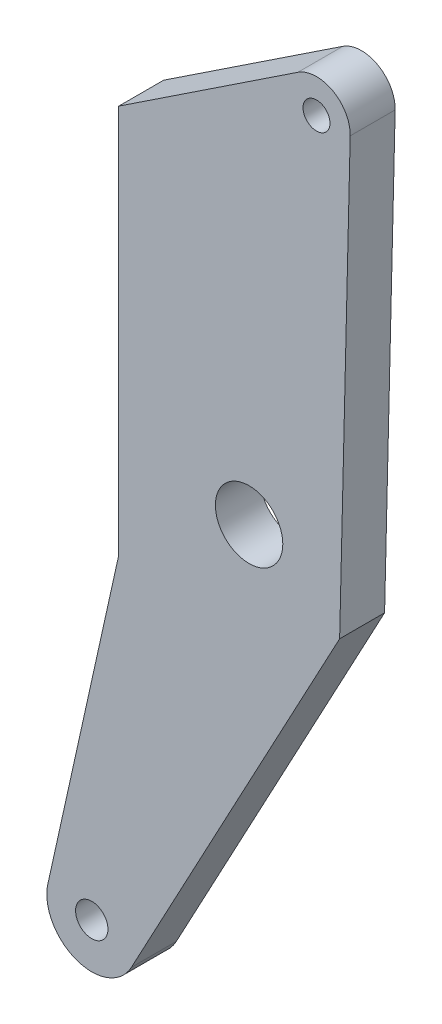
ISO-10303-21;
HEADER;
FILE_DESCRIPTION(('STEP AP214'),'2;1');
FILE_NAME('part.step','',(''),(''),'','','');
FILE_SCHEMA(('AUTOMOTIVE_DESIGN { 1 0 10303 214 1 1 1 1 }'));
ENDSEC;
DATA;
#1=APPLICATION_CONTEXT('core data for automotive mechanical design processes');
#2=APPLICATION_PROTOCOL_DEFINITION('international standard','automotive_design',2000,#1);
#3=PRODUCT_CONTEXT('',#1,'mechanical');
#4=PRODUCT('Part','Part','',(#3));
#5=PRODUCT_RELATED_PRODUCT_CATEGORY('part','',(#4));
#6=PRODUCT_DEFINITION_FORMATION('','',#4);
#7=PRODUCT_DEFINITION_CONTEXT('part definition',#1,'design');
#8=PRODUCT_DEFINITION('design','',#6,#7);
#9=PRODUCT_DEFINITION_SHAPE('','',#8);
#10=(LENGTH_UNIT() NAMED_UNIT(*) SI_UNIT(.MILLI.,.METRE.));
#11=(NAMED_UNIT(*) PLANE_ANGLE_UNIT() SI_UNIT($,.RADIAN.));
#12=(NAMED_UNIT(*) SI_UNIT($,.STERADIAN.) SOLID_ANGLE_UNIT());
#13=UNCERTAINTY_MEASURE_WITH_UNIT(LENGTH_MEASURE(1.E-05),#10,'distance_accuracy_value','');
#14=(GEOMETRIC_REPRESENTATION_CONTEXT(3) GLOBAL_UNCERTAINTY_ASSIGNED_CONTEXT((#13)) GLOBAL_UNIT_ASSIGNED_CONTEXT((#10,
#11,#12)) REPRESENTATION_CONTEXT('',''));
#15=CARTESIAN_POINT('',(0.,0.,0.));
#16=DIRECTION('',(0.,0.,1.));
#17=DIRECTION('',(1.,0.,0.));
#18=AXIS2_PLACEMENT_3D('',#15,#16,#17);
#19=CARTESIAN_POINT('',(31.75,114.3,6.35));
#20=DIRECTION('',(0.,0.,1.));
#21=DIRECTION('',(1.,0.,0.));
#22=AXIS2_PLACEMENT_3D('',#19,#20,#21);
#23=PLANE('',#22);
#24=CARTESIAN_POINT('',(22.225,59.4836059347447,6.35));
#25=DIRECTION('',(0.,0.,1.));
#26=DIRECTION('',(1.,0.,0.));
#27=AXIS2_PLACEMENT_3D('',#24,#25,#26);
#28=CIRCLE('',#27,4.7625);
#29=CARTESIAN_POINT('',(26.9875,59.4836059347447,6.35));
#30=VERTEX_POINT('',#29);
#31=EDGE_CURVE('E200',#30,#30,#28,.T.);
#32=ORIENTED_EDGE('',*,*,#31,.F.);
#33=EDGE_LOOP('',(#32));
#34=FACE_BOUND('',#33,.T.);
#35=CARTESIAN_POINT('',(31.75,114.3,6.35));
#36=DIRECTION('',(0.,0.,1.));
#37=DIRECTION('',(1.,0.,0.));
#38=AXIS2_PLACEMENT_3D('',#35,#36,#37);
#39=CIRCLE('',#38,4.76250000000002);
#40=CARTESIAN_POINT('',(36.511130591901,114.1857995759,6.35));
#41=VERTEX_POINT('',#40);
#42=CARTESIAN_POINT('',(29.1165690932561,118.268179420012,6.35));
#43=VERTEX_POINT('',#42);
#44=EDGE_CURVE('E163',#41,#43,#39,.T.);
#45=ORIENTED_EDGE('',*,*,#44,.T.);
#46=DIRECTION('',(-0.833213526511694,-0.55295137149477,0.));
#47=VECTOR('',#46,1.);
#48=CARTESIAN_POINT('',(3.80999999999993,101.473802417364,6.35));
#49=LINE('',#48,#47);
#50=CARTESIAN_POINT('',(3.80999999999993,101.473802417364,6.35));
#51=VERTEX_POINT('',#50);
#52=EDGE_CURVE('E105',#43,#51,#49,.T.);
#53=ORIENTED_EDGE('',*,*,#52,.T.);
#54=DIRECTION('',(0.,-1.,0.));
#55=VECTOR('',#54,1.);
#56=CARTESIAN_POINT('',(3.80999999999995,46.5296059347448,6.35));
#57=LINE('',#56,#55);
#58=CARTESIAN_POINT('',(3.80999999999995,46.5296059347448,6.35));
#59=VERTEX_POINT('',#58);
#60=EDGE_CURVE('E180',#51,#59,#57,.T.);
#61=ORIENTED_EDGE('',*,*,#60,.T.);
#62=DIRECTION('',(-0.216118883336142,-0.97636705611442,0.));
#63=VECTOR('',#62,1.);
#64=CARTESIAN_POINT('',(-6.09504730309555,1.78126313974876,6.35));
#65=LINE('',#64,#63);
#66=CARTESIAN_POINT('',(-6.09504730309555,1.78126313974876,6.35));
#67=VERTEX_POINT('',#66);
#68=EDGE_CURVE('E121',#59,#67,#65,.T.);
#69=ORIENTED_EDGE('',*,*,#68,.T.);
#70=CARTESIAN_POINT('',(0.,0.,6.35));
#71=DIRECTION('',(0.,0.,1.));
#72=DIRECTION('',(1.,0.,0.));
#73=AXIS2_PLACEMENT_3D('',#70,#71,#72);
#74=CIRCLE('',#73,6.35);
#75=CARTESIAN_POINT('',(5.59719657720947,-2.99898157314689,6.35));
#76=VERTEX_POINT('',#75);
#77=EDGE_CURVE('E115',#67,#76,#74,.T.);
#78=ORIENTED_EDGE('',*,*,#77,.T.);
#79=DIRECTION('',(0.472280562700297,0.881448279875507,0.));
#80=VECTOR('',#79,1.);
#81=CARTESIAN_POINT('',(5.59719657720947,-2.99898157314689,6.35));
#82=LINE('',#81,#80);
#83=CARTESIAN_POINT('',(35.0173801908307,51.9098423081026,6.35));
#84=VERTEX_POINT('',#83);
#85=EDGE_CURVE('E119',#76,#84,#82,.T.);
#86=ORIENTED_EDGE('',*,*,#85,.T.);
#87=DIRECTION('',(0.0239790916744878,0.999712460241677,0.));
#88=VECTOR('',#87,1.);
#89=CARTESIAN_POINT('',(35.0173801908307,51.9098423081026,6.35));
#90=LINE('',#89,#88);
#91=EDGE_CURVE('E65',#84,#41,#90,.T.);
#92=ORIENTED_EDGE('',*,*,#91,.T.);
#93=EDGE_LOOP('',(#45,#53,#61,#69,#78,#86,#92));
#94=FACE_BOUND('',#93,.T.);
#95=CARTESIAN_POINT('',(0.,0.,6.35));
#96=DIRECTION('',(0.,0.,1.));
#97=DIRECTION('',(1.,0.,0.));
#98=AXIS2_PLACEMENT_3D('',#95,#96,#97);
#99=CIRCLE('',#98,2.286);
#100=CARTESIAN_POINT('',(2.286,0.,6.35));
#101=VERTEX_POINT('',#100);
#102=EDGE_CURVE('E148',#101,#101,#99,.T.);
#103=ORIENTED_EDGE('',*,*,#102,.F.);
#104=EDGE_LOOP('',(#103));
#105=FACE_BOUND('',#104,.T.);
#106=CARTESIAN_POINT('',(31.75,114.3,6.35));
#107=DIRECTION('',(0.,0.,1.));
#108=DIRECTION('',(1.,0.,0.));
#109=AXIS2_PLACEMENT_3D('',#106,#107,#108);
#110=CIRCLE('',#109,1.90500000000001);
#111=CARTESIAN_POINT('',(33.655,114.3,6.35));
#112=VERTEX_POINT('',#111);
#113=EDGE_CURVE('E208',#112,#112,#110,.T.);
#114=ORIENTED_EDGE('',*,*,#113,.F.);
#115=EDGE_LOOP('',(#114));
#116=FACE_BOUND('',#115,.T.);
#117=ADVANCED_FACE('F47',(#34,#94,#105,#116),#23,.T.);
#118=CARTESIAN_POINT('',(31.75,114.3,0.));
#119=DIRECTION('',(0.,0.,1.));
#120=DIRECTION('',(1.,0.,0.));
#121=AXIS2_PLACEMENT_3D('',#118,#119,#120);
#122=PLANE('',#121);
#123=CARTESIAN_POINT('',(31.75,114.3,0.));
#124=DIRECTION('',(0.,0.,1.));
#125=DIRECTION('',(1.,0.,0.));
#126=AXIS2_PLACEMENT_3D('',#123,#124,#125);
#127=CIRCLE('',#126,4.76250000000002);
#128=CARTESIAN_POINT('',(36.511130591901,114.1857995759,0.));
#129=VERTEX_POINT('',#128);
#130=CARTESIAN_POINT('',(29.1165690932561,118.268179420012,0.));
#131=VERTEX_POINT('',#130);
#132=EDGE_CURVE('E143',#129,#131,#127,.T.);
#133=ORIENTED_EDGE('',*,*,#132,.F.);
#134=DIRECTION('',(0.0239790916744878,0.999712460241677,0.));
#135=VECTOR('',#134,1.);
#136=CARTESIAN_POINT('',(35.0173801908307,51.9098423081026,0.));
#137=LINE('',#136,#135);
#138=CARTESIAN_POINT('',(35.0173801908307,51.9098423081026,0.));
#139=VERTEX_POINT('',#138);
#140=EDGE_CURVE('E97',#139,#129,#137,.T.);
#141=ORIENTED_EDGE('',*,*,#140,.F.);
#142=DIRECTION('',(0.472280562700297,0.881448279875507,0.));
#143=VECTOR('',#142,1.);
#144=CARTESIAN_POINT('',(5.59719657720947,-2.99898157314689,0.));
#145=LINE('',#144,#143);
#146=CARTESIAN_POINT('',(5.59719657720947,-2.99898157314689,0.));
#147=VERTEX_POINT('',#146);
#148=EDGE_CURVE('E91',#147,#139,#145,.T.);
#149=ORIENTED_EDGE('',*,*,#148,.F.);
#150=CARTESIAN_POINT('',(0.,0.,0.));
#151=DIRECTION('',(0.,0.,1.));
#152=DIRECTION('',(1.,0.,0.));
#153=AXIS2_PLACEMENT_3D('',#150,#151,#152);
#154=CIRCLE('',#153,6.35);
#155=CARTESIAN_POINT('',(-6.09504730309555,1.78126313974876,0.));
#156=VERTEX_POINT('',#155);
#157=EDGE_CURVE('E130',#156,#147,#154,.T.);
#158=ORIENTED_EDGE('',*,*,#157,.F.);
#159=DIRECTION('',(-0.216118883336142,-0.97636705611442,0.));
#160=VECTOR('',#159,1.);
#161=CARTESIAN_POINT('',(-6.09504730309555,1.78126313974876,0.));
#162=LINE('',#161,#160);
#163=CARTESIAN_POINT('',(3.80999999999995,46.5296059347448,0.));
#164=VERTEX_POINT('',#163);
#165=EDGE_CURVE('E154',#164,#156,#162,.T.);
#166=ORIENTED_EDGE('',*,*,#165,.F.);
#167=DIRECTION('',(0.,-1.,0.));
#168=VECTOR('',#167,1.);
#169=CARTESIAN_POINT('',(3.80999999999995,46.5296059347448,0.));
#170=LINE('',#169,#168);
#171=CARTESIAN_POINT('',(3.80999999999993,101.473802417364,0.));
#172=VERTEX_POINT('',#171);
#173=EDGE_CURVE('E151',#172,#164,#170,.T.);
#174=ORIENTED_EDGE('',*,*,#173,.F.);
#175=DIRECTION('',(-0.833213526511694,-0.55295137149477,0.));
#176=VECTOR('',#175,1.);
#177=CARTESIAN_POINT('',(3.80999999999993,101.473802417364,0.));
#178=LINE('',#177,#176);
#179=EDGE_CURVE('E147',#131,#172,#178,.T.);
#180=ORIENTED_EDGE('',*,*,#179,.F.);
#181=EDGE_LOOP('',(#133,#141,#149,#158,#166,#174,#180));
#182=FACE_BOUND('',#181,.T.);
#183=CARTESIAN_POINT('',(0.,0.,0.));
#184=DIRECTION('',(0.,0.,1.));
#185=DIRECTION('',(1.,0.,0.));
#186=AXIS2_PLACEMENT_3D('',#183,#184,#185);
#187=CIRCLE('',#186,2.286);
#188=CARTESIAN_POINT('',(2.286,0.,0.));
#189=VERTEX_POINT('',#188);
#190=EDGE_CURVE('E196',#189,#189,#187,.T.);
#191=ORIENTED_EDGE('',*,*,#190,.T.);
#192=EDGE_LOOP('',(#191));
#193=FACE_BOUND('',#192,.T.);
#194=CARTESIAN_POINT('',(22.225,59.4836059347447,0.));
#195=DIRECTION('',(0.,0.,1.));
#196=DIRECTION('',(1.,0.,0.));
#197=AXIS2_PLACEMENT_3D('',#194,#195,#196);
#198=CIRCLE('',#197,4.7625);
#199=CARTESIAN_POINT('',(26.9875,59.4836059347447,0.));
#200=VERTEX_POINT('',#199);
#201=EDGE_CURVE('E204',#200,#200,#198,.T.);
#202=ORIENTED_EDGE('',*,*,#201,.T.);
#203=EDGE_LOOP('',(#202));
#204=FACE_BOUND('',#203,.T.);
#205=CARTESIAN_POINT('',(31.75,114.3,0.));
#206=DIRECTION('',(0.,0.,1.));
#207=DIRECTION('',(1.,0.,0.));
#208=AXIS2_PLACEMENT_3D('',#205,#206,#207);
#209=CIRCLE('',#208,1.90500000000001);
#210=CARTESIAN_POINT('',(33.655,114.3,0.));
#211=VERTEX_POINT('',#210);
#212=EDGE_CURVE('E212',#211,#211,#209,.T.);
#213=ORIENTED_EDGE('',*,*,#212,.T.);
#214=EDGE_LOOP('',(#213));
#215=FACE_BOUND('',#214,.T.);
#216=ADVANCED_FACE('F184',(#182,#193,#204,#215),#122,.F.);
#217=CARTESIAN_POINT('',(31.75,114.3,6.35));
#218=DIRECTION('',(0.,0.,-1.));
#219=DIRECTION('',(-1.,0.,0.));
#220=AXIS2_PLACEMENT_3D('',#217,#218,#219);
#221=CYLINDRICAL_SURFACE('',#220,4.76250000000002);
#222=ORIENTED_EDGE('',*,*,#132,.T.);
#223=DIRECTION('',(0.,0.,-1.));
#224=VECTOR('',#223,1.);
#225=CARTESIAN_POINT('',(29.1165690932561,118.268179420012,6.35));
#226=LINE('',#225,#224);
#227=EDGE_CURVE('E11',#43,#131,#226,.T.);
#228=ORIENTED_EDGE('',*,*,#227,.F.);
#229=ORIENTED_EDGE('',*,*,#44,.F.);
#230=DIRECTION('',(0.,0.,-1.));
#231=VECTOR('',#230,1.);
#232=CARTESIAN_POINT('',(36.511130591901,114.1857995759,6.35));
#233=LINE('',#232,#231);
#234=EDGE_CURVE('E139',#41,#129,#233,.T.);
#235=ORIENTED_EDGE('',*,*,#234,.T.);
#236=EDGE_LOOP('',(#222,#228,#229,#235));
#237=FACE_BOUND('',#236,.T.);
#238=ADVANCED_FACE('F49',(#237),#221,.T.);
#239=CARTESIAN_POINT('',(3.80999999999993,101.473802417364,6.35));
#240=DIRECTION('',(0.55295137149477,-0.833213526511694,0.));
#241=DIRECTION('',(0.833213526511694,0.55295137149477,0.));
#242=AXIS2_PLACEMENT_3D('',#239,#240,#241);
#243=PLANE('',#242);
#244=ORIENTED_EDGE('',*,*,#179,.T.);
#245=DIRECTION('',(0.,0.,-1.));
#246=VECTOR('',#245,1.);
#247=CARTESIAN_POINT('',(3.80999999999993,101.473802417364,6.35));
#248=LINE('',#247,#246);
#249=EDGE_CURVE('E57',#51,#172,#248,.T.);
#250=ORIENTED_EDGE('',*,*,#249,.F.);
#251=ORIENTED_EDGE('',*,*,#52,.F.);
#252=ORIENTED_EDGE('',*,*,#227,.T.);
#253=EDGE_LOOP('',(#244,#250,#251,#252));
#254=FACE_BOUND('',#253,.T.);
#255=ADVANCED_FACE('F247',(#254),#243,.F.);
#256=CARTESIAN_POINT('',(3.80999999999995,46.5296059347448,6.35));
#257=DIRECTION('',(1.,0.,0.));
#258=DIRECTION('',(0.,1.,0.));
#259=AXIS2_PLACEMENT_3D('',#256,#257,#258);
#260=PLANE('',#259);
#261=CARTESIAN_POINT('',(3.80999999999993,89.8767041760544,3.175));
#262=DIRECTION('',(-1.,0.,0.));
#263=DIRECTION('',(0.,-1.,0.));
#264=AXIS2_PLACEMENT_3D('',#261,#262,#263);
#265=CIRCLE('',#264,1.90500000000001);
#266=CARTESIAN_POINT('',(3.80999999999993,87.9717041760544,3.175));
#267=VERTEX_POINT('',#266);
#268=EDGE_CURVE('E228',#267,#267,#265,.T.);
#269=ORIENTED_EDGE('',*,*,#268,.F.);
#270=EDGE_LOOP('',(#269));
#271=FACE_BOUND('',#270,.T.);
#272=CARTESIAN_POINT('',(3.80999999999994,58.1267041760544,3.175));
#273=DIRECTION('',(-1.,0.,0.));
#274=DIRECTION('',(0.,-1.,0.));
#275=AXIS2_PLACEMENT_3D('',#272,#273,#274);
#276=CIRCLE('',#275,1.905);
#277=CARTESIAN_POINT('',(3.80999999999994,56.2217041760544,3.175));
#278=VERTEX_POINT('',#277);
#279=EDGE_CURVE('E224',#278,#278,#276,.T.);
#280=ORIENTED_EDGE('',*,*,#279,.F.);
#281=EDGE_LOOP('',(#280));
#282=FACE_BOUND('',#281,.T.);
#283=ORIENTED_EDGE('',*,*,#173,.T.);
#284=DIRECTION('',(0.,0.,-1.));
#285=VECTOR('',#284,1.);
#286=CARTESIAN_POINT('',(3.80999999999995,46.5296059347448,6.35));
#287=LINE('',#286,#285);
#288=EDGE_CURVE('E170',#59,#164,#287,.T.);
#289=ORIENTED_EDGE('',*,*,#288,.F.);
#290=ORIENTED_EDGE('',*,*,#60,.F.);
#291=ORIENTED_EDGE('',*,*,#249,.T.);
#292=EDGE_LOOP('',(#283,#289,#290,#291));
#293=FACE_BOUND('',#292,.T.);
#294=ADVANCED_FACE('F178',(#271,#282,#293),#260,.F.);
#295=CARTESIAN_POINT('',(-6.09504730309555,1.78126313974876,6.35));
#296=DIRECTION('',(0.97636705611442,-0.216118883336142,0.));
#297=DIRECTION('',(0.216118883336142,0.97636705611442,0.));
#298=AXIS2_PLACEMENT_3D('',#295,#296,#297);
#299=PLANE('',#298);
#300=ORIENTED_EDGE('',*,*,#165,.T.);
#301=DIRECTION('',(0.,0.,-1.));
#302=VECTOR('',#301,1.);
#303=CARTESIAN_POINT('',(-6.09504730309555,1.78126313974876,6.35));
#304=LINE('',#303,#302);
#305=EDGE_CURVE('E132',#67,#156,#304,.T.);
#306=ORIENTED_EDGE('',*,*,#305,.F.);
#307=ORIENTED_EDGE('',*,*,#68,.F.);
#308=ORIENTED_EDGE('',*,*,#288,.T.);
#309=EDGE_LOOP('',(#300,#306,#307,#308));
#310=FACE_BOUND('',#309,.T.);
#311=ADVANCED_FACE('F187',(#310),#299,.F.);
#312=CARTESIAN_POINT('',(0.,0.,6.35));
#313=DIRECTION('',(0.,0.,-1.));
#314=DIRECTION('',(-1.,0.,0.));
#315=AXIS2_PLACEMENT_3D('',#312,#313,#314);
#316=CYLINDRICAL_SURFACE('',#315,6.35);
#317=ORIENTED_EDGE('',*,*,#157,.T.);
#318=DIRECTION('',(0.,0.,-1.));
#319=VECTOR('',#318,1.);
#320=CARTESIAN_POINT('',(5.59719657720947,-2.99898157314689,6.35));
#321=LINE('',#320,#319);
#322=EDGE_CURVE('E127',#76,#147,#321,.T.);
#323=ORIENTED_EDGE('',*,*,#322,.F.);
#324=ORIENTED_EDGE('',*,*,#77,.F.);
#325=ORIENTED_EDGE('',*,*,#305,.T.);
#326=EDGE_LOOP('',(#317,#323,#324,#325));
#327=FACE_BOUND('',#326,.T.);
#328=ADVANCED_FACE('F128',(#327),#316,.T.);
#329=CARTESIAN_POINT('',(5.59719657720947,-2.99898157314689,6.35));
#330=DIRECTION('',(-0.881448279875508,0.472280562700297,0.));
#331=DIRECTION('',(-0.472280562700297,-0.881448279875508,0.));
#332=AXIS2_PLACEMENT_3D('',#329,#330,#331);
#333=PLANE('',#332);
#334=ORIENTED_EDGE('',*,*,#148,.T.);
#335=DIRECTION('',(0.,0.,-1.));
#336=VECTOR('',#335,1.);
#337=CARTESIAN_POINT('',(35.0173801908307,51.9098423081026,6.35));
#338=LINE('',#337,#336);
#339=EDGE_CURVE('E133',#84,#139,#338,.T.);
#340=ORIENTED_EDGE('',*,*,#339,.F.);
#341=ORIENTED_EDGE('',*,*,#85,.F.);
#342=ORIENTED_EDGE('',*,*,#322,.T.);
#343=EDGE_LOOP('',(#334,#340,#341,#342));
#344=FACE_BOUND('',#343,.T.);
#345=ADVANCED_FACE('F135',(#344),#333,.F.);
#346=CARTESIAN_POINT('',(35.0173801908307,51.9098423081026,6.35));
#347=DIRECTION('',(-0.999712460241677,0.0239790916744878,0.));
#348=DIRECTION('',(-0.0239790916744878,-0.999712460241677,0.));
#349=AXIS2_PLACEMENT_3D('',#346,#347,#348);
#350=PLANE('',#349);
#351=ORIENTED_EDGE('',*,*,#140,.T.);
#352=ORIENTED_EDGE('',*,*,#234,.F.);
#353=ORIENTED_EDGE('',*,*,#91,.F.);
#354=ORIENTED_EDGE('',*,*,#339,.T.);
#355=EDGE_LOOP('',(#351,#352,#353,#354));
#356=FACE_BOUND('',#355,.T.);
#357=ADVANCED_FACE('F280',(#356),#350,.F.);
#358=CARTESIAN_POINT('',(0.,0.,6.35));
#359=DIRECTION('',(0.,0.,-1.));
#360=DIRECTION('',(-1.,0.,0.));
#361=AXIS2_PLACEMENT_3D('',#358,#359,#360);
#362=CYLINDRICAL_SURFACE('',#361,2.286);
#363=ORIENTED_EDGE('',*,*,#102,.T.);
#364=EDGE_LOOP('',(#363));
#365=FACE_BOUND('',#364,.T.);
#366=ORIENTED_EDGE('',*,*,#190,.F.);
#367=EDGE_LOOP('',(#366));
#368=FACE_BOUND('',#367,.T.);
#369=ADVANCED_FACE('F277',(#365,#368),#362,.F.);
#370=CARTESIAN_POINT('',(22.225,59.4836059347447,6.35));
#371=DIRECTION('',(0.,0.,-1.));
#372=DIRECTION('',(-1.,0.,0.));
#373=AXIS2_PLACEMENT_3D('',#370,#371,#372);
#374=CYLINDRICAL_SURFACE('',#373,4.7625);
#375=ORIENTED_EDGE('',*,*,#31,.T.);
#376=EDGE_LOOP('',(#375));
#377=FACE_BOUND('',#376,.T.);
#378=ORIENTED_EDGE('',*,*,#201,.F.);
#379=EDGE_LOOP('',(#378));
#380=FACE_BOUND('',#379,.T.);
#381=ADVANCED_FACE('F263',(#377,#380),#374,.F.);
#382=CARTESIAN_POINT('',(31.75,114.3,6.35));
#383=DIRECTION('',(0.,0.,-1.));
#384=DIRECTION('',(-1.,0.,0.));
#385=AXIS2_PLACEMENT_3D('',#382,#383,#384);
#386=CYLINDRICAL_SURFACE('',#385,1.90500000000001);
#387=ORIENTED_EDGE('',*,*,#113,.T.);
#388=EDGE_LOOP('',(#387));
#389=FACE_BOUND('',#388,.T.);
#390=ORIENTED_EDGE('',*,*,#212,.F.);
#391=EDGE_LOOP('',(#390));
#392=FACE_BOUND('',#391,.T.);
#393=ADVANCED_FACE('F253',(#389,#392),#386,.F.);
#394=CARTESIAN_POINT('',(11.7474999999999,58.1267041760544,3.175));
#395=DIRECTION('',(-1.,0.,0.));
#396=DIRECTION('',(0.,-1.,0.));
#397=AXIS2_PLACEMENT_3D('',#394,#395,#396);
#398=CYLINDRICAL_SURFACE('',#397,1.905);
#399=CARTESIAN_POINT('',(11.7474999999999,58.1267041760544,3.175));
#400=DIRECTION('',(-1.,0.,0.));
#401=DIRECTION('',(0.,-1.,0.));
#402=AXIS2_PLACEMENT_3D('',#399,#400,#401);
#403=CIRCLE('',#402,1.905);
#404=CARTESIAN_POINT('',(11.7474999999999,56.2217041760544,3.175));
#405=VERTEX_POINT('',#404);
#406=EDGE_CURVE('E220',#405,#405,#403,.T.);
#407=ORIENTED_EDGE('',*,*,#406,.F.);
#408=EDGE_LOOP('',(#407));
#409=FACE_BOUND('',#408,.T.);
#410=ORIENTED_EDGE('',*,*,#279,.T.);
#411=EDGE_LOOP('',(#410));
#412=FACE_BOUND('',#411,.T.);
#413=ADVANCED_FACE('F251',(#409,#412),#398,.F.);
#414=CARTESIAN_POINT('',(11.7474999999999,58.1267041760544,3.175));
#415=DIRECTION('',(-1.,0.,0.));
#416=DIRECTION('',(0.,-1.,0.));
#417=AXIS2_PLACEMENT_3D('',#414,#415,#416);
#418=PLANE('',#417);
#419=ORIENTED_EDGE('',*,*,#406,.T.);
#420=EDGE_LOOP('',(#419));
#421=FACE_BOUND('',#420,.T.);
#422=ADVANCED_FACE('F241',(#421),#418,.T.);
#423=CARTESIAN_POINT('',(11.7474999999999,89.8767041760544,3.175));
#424=DIRECTION('',(-1.,0.,0.));
#425=DIRECTION('',(0.,-1.,0.));
#426=AXIS2_PLACEMENT_3D('',#423,#424,#425);
#427=CYLINDRICAL_SURFACE('',#426,1.90500000000001);
#428=CARTESIAN_POINT('',(11.7474999999999,89.8767041760544,3.175));
#429=DIRECTION('',(-1.,0.,0.));
#430=DIRECTION('',(0.,-1.,0.));
#431=AXIS2_PLACEMENT_3D('',#428,#429,#430);
#432=CIRCLE('',#431,1.90500000000001);
#433=CARTESIAN_POINT('',(11.7474999999999,87.9717041760544,3.175));
#434=VERTEX_POINT('',#433);
#435=EDGE_CURVE('E216',#434,#434,#432,.T.);
#436=ORIENTED_EDGE('',*,*,#435,.F.);
#437=EDGE_LOOP('',(#436));
#438=FACE_BOUND('',#437,.T.);
#439=ORIENTED_EDGE('',*,*,#268,.T.);
#440=EDGE_LOOP('',(#439));
#441=FACE_BOUND('',#440,.T.);
#442=ADVANCED_FACE('F238',(#438,#441),#427,.F.);
#443=CARTESIAN_POINT('',(11.7474999999999,89.8767041760544,3.175));
#444=DIRECTION('',(-1.,0.,0.));
#445=DIRECTION('',(0.,-1.,0.));
#446=AXIS2_PLACEMENT_3D('',#443,#444,#445);
#447=PLANE('',#446);
#448=ORIENTED_EDGE('',*,*,#435,.T.);
#449=EDGE_LOOP('',(#448));
#450=FACE_BOUND('',#449,.T.);
#451=ADVANCED_FACE('F236',(#450),#447,.T.);
#452=CLOSED_SHELL('',(#117,#216,#238,#255,#294,#311,#328,#345,#357,#369,#381,#393,#413,#422,
#442,#451));
#453=MANIFOLD_SOLID_BREP('B2',#452);
#454=ADVANCED_BREP_SHAPE_REPRESENTATION('',(#18,#453),#14);
#455=SHAPE_DEFINITION_REPRESENTATION(#9,#454);
ENDSEC;
END-ISO-10303-21;
